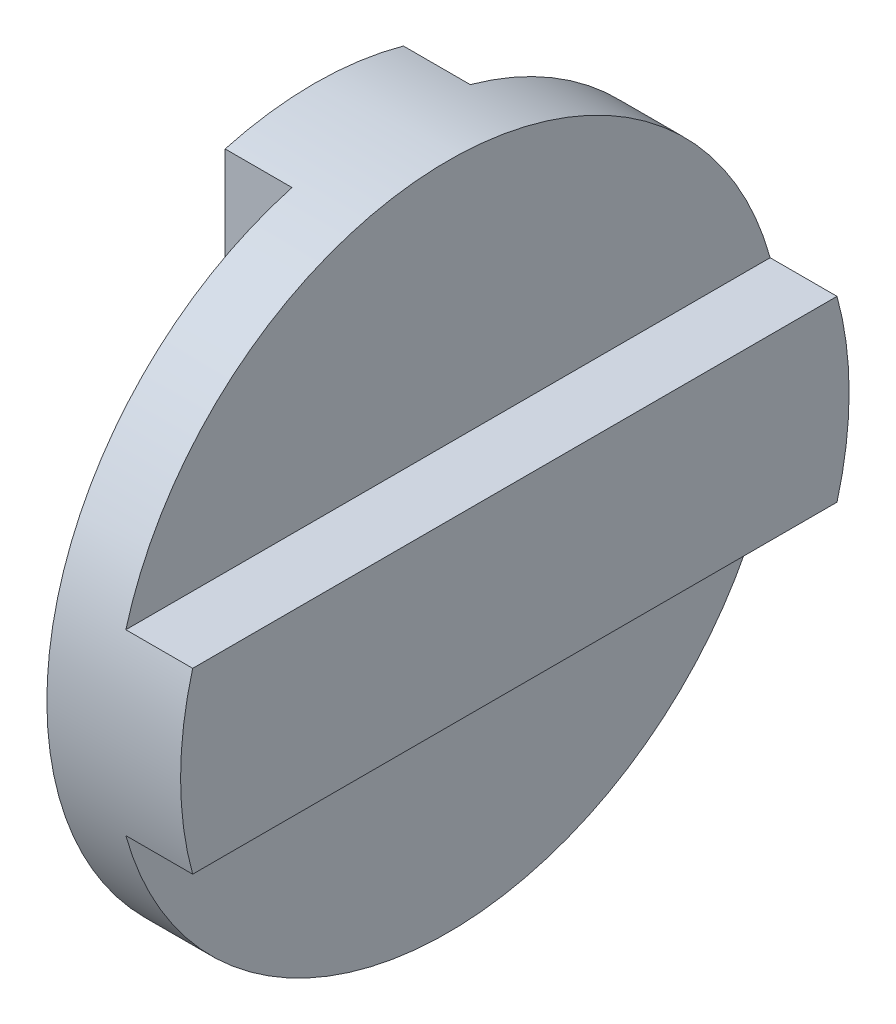
ISO-10303-21;
HEADER;
FILE_DESCRIPTION(('STEP AP214'),'2;1');
FILE_NAME('part.step','',(''),(''),'','','');
FILE_SCHEMA(('AUTOMOTIVE_DESIGN { 1 0 10303 214 1 1 1 1 }'));
ENDSEC;
DATA;
#1=APPLICATION_CONTEXT('core data for automotive mechanical design processes');
#2=APPLICATION_PROTOCOL_DEFINITION('international standard','automotive_design',2000,#1);
#3=PRODUCT_CONTEXT('',#1,'mechanical');
#4=PRODUCT('Part','Part','',(#3));
#5=PRODUCT_RELATED_PRODUCT_CATEGORY('part','',(#4));
#6=PRODUCT_DEFINITION_FORMATION('','',#4);
#7=PRODUCT_DEFINITION_CONTEXT('part definition',#1,'design');
#8=PRODUCT_DEFINITION('design','',#6,#7);
#9=PRODUCT_DEFINITION_SHAPE('','',#8);
#10=(LENGTH_UNIT() NAMED_UNIT(*) SI_UNIT(.MILLI.,.METRE.));
#11=(NAMED_UNIT(*) PLANE_ANGLE_UNIT() SI_UNIT($,.RADIAN.));
#12=(NAMED_UNIT(*) SI_UNIT($,.STERADIAN.) SOLID_ANGLE_UNIT());
#13=UNCERTAINTY_MEASURE_WITH_UNIT(LENGTH_MEASURE(1.E-05),#10,'distance_accuracy_value','');
#14=(GEOMETRIC_REPRESENTATION_CONTEXT(3) GLOBAL_UNCERTAINTY_ASSIGNED_CONTEXT((#13)) GLOBAL_UNIT_ASSIGNED_CONTEXT((#10,
#11,#12)) REPRESENTATION_CONTEXT('',''));
#15=CARTESIAN_POINT('',(0.,0.,0.));
#16=DIRECTION('',(0.,0.,1.));
#17=DIRECTION('',(1.,0.,0.));
#18=AXIS2_PLACEMENT_3D('',#15,#16,#17);
#19=CARTESIAN_POINT('',(0.,0.,0.));
#20=DIRECTION('',(1.,0.,0.));
#21=DIRECTION('',(0.,0.,-1.));
#22=AXIS2_PLACEMENT_3D('',#19,#20,#21);
#23=PLANE('',#22);
#24=DIRECTION('',(0.,1.,0.));
#25=VECTOR('',#24,1.);
#26=CARTESIAN_POINT('',(0.,72.2841614740048,20.));
#27=LINE('',#26,#25);
#28=CARTESIAN_POINT('',(0.,-72.2841614740048,20.));
#29=VERTEX_POINT('',#28);
#30=CARTESIAN_POINT('',(0.,72.2841614740048,20.));
#31=VERTEX_POINT('',#30);
#32=EDGE_CURVE('E61',#29,#31,#27,.T.);
#33=ORIENTED_EDGE('',*,*,#32,.F.);
#34=CARTESIAN_POINT('',(0.,0.,0.));
#35=DIRECTION('',(1.,0.,0.));
#36=DIRECTION('',(0.,0.,-1.));
#37=AXIS2_PLACEMENT_3D('',#34,#35,#36);
#38=CIRCLE('',#37,75.);
#39=EDGE_CURVE('E64',#31,#29,#38,.T.);
#40=ORIENTED_EDGE('',*,*,#39,.F.);
#41=EDGE_LOOP('',(#33,#40));
#42=FACE_BOUND('',#41,.T.);
#43=ADVANCED_FACE('F45',(#42),#23,.F.);
#44=DIRECTION('',(0.,-1.,0.));
#45=VECTOR('',#44,1.);
#46=CARTESIAN_POINT('',(0.,72.2841614740048,-20.));
#47=LINE('',#46,#45);
#48=CARTESIAN_POINT('',(0.,72.2841614740048,-20.));
#49=VERTEX_POINT('',#48);
#50=CARTESIAN_POINT('',(0.,-72.2841614740048,-20.));
#51=VERTEX_POINT('',#50);
#52=EDGE_CURVE('E302',#49,#51,#47,.T.);
#53=ORIENTED_EDGE('',*,*,#52,.F.);
#54=EDGE_CURVE('E49',#51,#49,#38,.T.);
#55=ORIENTED_EDGE('',*,*,#54,.F.);
#56=EDGE_LOOP('',(#53,#55));
#57=FACE_BOUND('',#56,.T.);
#58=ADVANCED_FACE('F201',(#57),#23,.F.);
#59=CARTESIAN_POINT('',(15.,0.,0.));
#60=DIRECTION('',(1.,0.,0.));
#61=DIRECTION('',(0.,0.,-1.));
#62=AXIS2_PLACEMENT_3D('',#59,#60,#61);
#63=PLANE('',#62);
#64=DIRECTION('',(0.,0.,1.));
#65=VECTOR('',#64,1.);
#66=CARTESIAN_POINT('',(15.,20.,72.2841614740048));
#67=LINE('',#66,#65);
#68=CARTESIAN_POINT('',(15.,20.,-72.2841614740048));
#69=VERTEX_POINT('',#68);
#70=CARTESIAN_POINT('',(15.,20.,72.2841614740048));
#71=VERTEX_POINT('',#70);
#72=EDGE_CURVE('E138',#69,#71,#67,.T.);
#73=ORIENTED_EDGE('',*,*,#72,.F.);
#74=CARTESIAN_POINT('',(15.,0.,0.));
#75=DIRECTION('',(1.,0.,0.));
#76=DIRECTION('',(0.,0.,-1.));
#77=AXIS2_PLACEMENT_3D('',#74,#75,#76);
#78=CIRCLE('',#77,75.);
#79=EDGE_CURVE('E11',#69,#71,#78,.T.);
#80=ORIENTED_EDGE('',*,*,#79,.T.);
#81=EDGE_LOOP('',(#73,#80));
#82=FACE_BOUND('',#81,.T.);
#83=ADVANCED_FACE('F199',(#82),#63,.T.);
#84=CARTESIAN_POINT('',(15.,0.,0.));
#85=DIRECTION('',(-1.,0.,0.));
#86=DIRECTION('',(0.,0.,1.));
#87=AXIS2_PLACEMENT_3D('',#84,#85,#86);
#88=CYLINDRICAL_SURFACE('',#87,75.);
#89=ORIENTED_EDGE('',*,*,#79,.F.);
#90=DIRECTION('',(-1.,0.,0.));
#91=VECTOR('',#90,1.);
#92=CARTESIAN_POINT('',(30.,20.,-72.2841614740048));
#93=LINE('',#92,#91);
#94=CARTESIAN_POINT('',(30.,20.,-72.2841614740048));
#95=VERTEX_POINT('',#94);
#96=EDGE_CURVE('E164',#95,#69,#93,.T.);
#97=ORIENTED_EDGE('',*,*,#96,.F.);
#98=CARTESIAN_POINT('',(30.,0.,0.));
#99=DIRECTION('',(1.,0.,0.));
#100=DIRECTION('',(0.,0.,-1.));
#101=AXIS2_PLACEMENT_3D('',#98,#99,#100);
#102=CIRCLE('',#101,75.);
#103=CARTESIAN_POINT('',(30.,-20.,-72.2841614740048));
#104=VERTEX_POINT('',#103);
#105=EDGE_CURVE('E151',#104,#95,#102,.T.);
#106=ORIENTED_EDGE('',*,*,#105,.F.);
#107=DIRECTION('',(-1.,0.,0.));
#108=VECTOR('',#107,1.);
#109=CARTESIAN_POINT('',(30.,-20.,-72.2841614740048));
#110=LINE('',#109,#108);
#111=CARTESIAN_POINT('',(15.,-20.,-72.2841614740048));
#112=VERTEX_POINT('',#111);
#113=EDGE_CURVE('E168',#104,#112,#110,.T.);
#114=ORIENTED_EDGE('',*,*,#113,.T.);
#115=CARTESIAN_POINT('',(15.,-20.,72.2841614740048));
#116=VERTEX_POINT('',#115);
#117=EDGE_CURVE('E55',#116,#112,#78,.T.);
#118=ORIENTED_EDGE('',*,*,#117,.F.);
#119=DIRECTION('',(-1.,0.,0.));
#120=VECTOR('',#119,1.);
#121=CARTESIAN_POINT('',(30.,-20.,72.2841614740048));
#122=LINE('',#121,#120);
#123=CARTESIAN_POINT('',(30.,-20.,72.2841614740048));
#124=VERTEX_POINT('',#123);
#125=EDGE_CURVE('E172',#124,#116,#122,.T.);
#126=ORIENTED_EDGE('',*,*,#125,.F.);
#127=CARTESIAN_POINT('',(30.,0.,0.));
#128=DIRECTION('',(1.,0.,0.));
#129=DIRECTION('',(0.,0.,-1.));
#130=AXIS2_PLACEMENT_3D('',#127,#128,#129);
#131=CIRCLE('',#130,75.);
#132=CARTESIAN_POINT('',(30.,20.,72.2841614740048));
#133=VERTEX_POINT('',#132);
#134=EDGE_CURVE('E144',#133,#124,#131,.T.);
#135=ORIENTED_EDGE('',*,*,#134,.F.);
#136=DIRECTION('',(-1.,0.,0.));
#137=VECTOR('',#136,1.);
#138=CARTESIAN_POINT('',(30.,20.,72.2841614740048));
#139=LINE('',#138,#137);
#140=EDGE_CURVE('E156',#133,#71,#139,.T.);
#141=ORIENTED_EDGE('',*,*,#140,.T.);
#142=EDGE_LOOP('',(#89,#97,#106,#114,#118,#126,#135,#141));
#143=FACE_BOUND('',#142,.T.);
#144=ORIENTED_EDGE('',*,*,#54,.T.);
#145=DIRECTION('',(1.,0.,0.));
#146=VECTOR('',#145,1.);
#147=CARTESIAN_POINT('',(-15.,72.2841614740048,-20.));
#148=LINE('',#147,#146);
#149=CARTESIAN_POINT('',(-15.,72.2841614740048,-20.));
#150=VERTEX_POINT('',#149);
#151=EDGE_CURVE('E113',#150,#49,#148,.T.);
#152=ORIENTED_EDGE('',*,*,#151,.F.);
#153=CARTESIAN_POINT('',(-15.,0.,0.));
#154=DIRECTION('',(-1.,0.,0.));
#155=DIRECTION('',(0.,0.,1.));
#156=AXIS2_PLACEMENT_3D('',#153,#154,#155);
#157=CIRCLE('',#156,75.);
#158=CARTESIAN_POINT('',(-15.,72.2841614740048,20.));
#159=VERTEX_POINT('',#158);
#160=EDGE_CURVE('E120',#159,#150,#157,.T.);
#161=ORIENTED_EDGE('',*,*,#160,.F.);
#162=DIRECTION('',(1.,0.,0.));
#163=VECTOR('',#162,1.);
#164=CARTESIAN_POINT('',(-15.,72.2841614740048,20.));
#165=LINE('',#164,#163);
#166=EDGE_CURVE('E300',#159,#31,#165,.T.);
#167=ORIENTED_EDGE('',*,*,#166,.T.);
#168=ORIENTED_EDGE('',*,*,#39,.T.);
#169=DIRECTION('',(1.,0.,0.));
#170=VECTOR('',#169,1.);
#171=CARTESIAN_POINT('',(-15.,-72.2841614740048,20.));
#172=LINE('',#171,#170);
#173=CARTESIAN_POINT('',(-15.,-72.2841614740048,20.));
#174=VERTEX_POINT('',#173);
#175=EDGE_CURVE('E140',#174,#29,#172,.T.);
#176=ORIENTED_EDGE('',*,*,#175,.F.);
#177=CARTESIAN_POINT('',(-15.,0.,0.));
#178=DIRECTION('',(-1.,0.,0.));
#179=DIRECTION('',(0.,0.,1.));
#180=AXIS2_PLACEMENT_3D('',#177,#178,#179);
#181=CIRCLE('',#180,75.);
#182=CARTESIAN_POINT('',(-15.,-72.2841614740048,-20.));
#183=VERTEX_POINT('',#182);
#184=EDGE_CURVE('E119',#183,#174,#181,.T.);
#185=ORIENTED_EDGE('',*,*,#184,.F.);
#186=DIRECTION('',(1.,0.,0.));
#187=VECTOR('',#186,1.);
#188=CARTESIAN_POINT('',(-15.,-72.2841614740048,-20.));
#189=LINE('',#188,#187);
#190=EDGE_CURVE('E115',#183,#51,#189,.T.);
#191=ORIENTED_EDGE('',*,*,#190,.T.);
#192=EDGE_LOOP('',(#144,#152,#161,#167,#168,#176,#185,#191));
#193=FACE_BOUND('',#192,.T.);
#194=ADVANCED_FACE('F47',(#143,#193),#88,.T.);
#195=DIRECTION('',(0.,0.,-1.));
#196=VECTOR('',#195,1.);
#197=CARTESIAN_POINT('',(15.,-20.,72.2841614740048));
#198=LINE('',#197,#196);
#199=EDGE_CURVE('E133',#116,#112,#198,.T.);
#200=ORIENTED_EDGE('',*,*,#199,.F.);
#201=ORIENTED_EDGE('',*,*,#117,.T.);
#202=EDGE_LOOP('',(#200,#201));
#203=FACE_BOUND('',#202,.T.);
#204=ADVANCED_FACE('F184',(#203),#63,.T.);
#205=CARTESIAN_POINT('',(30.,-20.,72.2841614740048));
#206=DIRECTION('',(0.,1.,0.));
#207=DIRECTION('',(0.,0.,1.));
#208=AXIS2_PLACEMENT_3D('',#205,#206,#207);
#209=PLANE('',#208);
#210=ORIENTED_EDGE('',*,*,#199,.T.);
#211=ORIENTED_EDGE('',*,*,#113,.F.);
#212=DIRECTION('',(0.,0.,-1.));
#213=VECTOR('',#212,1.);
#214=CARTESIAN_POINT('',(30.,-20.,72.2841614740048));
#215=LINE('',#214,#213);
#216=EDGE_CURVE('E148',#124,#104,#215,.T.);
#217=ORIENTED_EDGE('',*,*,#216,.F.);
#218=ORIENTED_EDGE('',*,*,#125,.T.);
#219=EDGE_LOOP('',(#210,#211,#217,#218));
#220=FACE_BOUND('',#219,.T.);
#221=ADVANCED_FACE('F187',(#220),#209,.F.);
#222=CARTESIAN_POINT('',(30.,20.,72.2841614740048));
#223=DIRECTION('',(0.,-1.,0.));
#224=DIRECTION('',(0.,0.,-1.));
#225=AXIS2_PLACEMENT_3D('',#222,#223,#224);
#226=PLANE('',#225);
#227=ORIENTED_EDGE('',*,*,#72,.T.);
#228=ORIENTED_EDGE('',*,*,#140,.F.);
#229=DIRECTION('',(0.,0.,1.));
#230=VECTOR('',#229,1.);
#231=CARTESIAN_POINT('',(30.,20.,72.2841614740048));
#232=LINE('',#231,#230);
#233=EDGE_CURVE('E154',#95,#133,#232,.T.);
#234=ORIENTED_EDGE('',*,*,#233,.F.);
#235=ORIENTED_EDGE('',*,*,#96,.T.);
#236=EDGE_LOOP('',(#227,#228,#234,#235));
#237=FACE_BOUND('',#236,.T.);
#238=ADVANCED_FACE('F197',(#237),#226,.F.);
#239=CARTESIAN_POINT('',(30.,0.,0.));
#240=DIRECTION('',(1.,0.,0.));
#241=DIRECTION('',(0.,0.,-1.));
#242=AXIS2_PLACEMENT_3D('',#239,#240,#241);
#243=PLANE('',#242);
#244=ORIENTED_EDGE('',*,*,#134,.T.);
#245=ORIENTED_EDGE('',*,*,#216,.T.);
#246=ORIENTED_EDGE('',*,*,#105,.T.);
#247=ORIENTED_EDGE('',*,*,#233,.T.);
#248=EDGE_LOOP('',(#244,#245,#246,#247));
#249=FACE_BOUND('',#248,.T.);
#250=ADVANCED_FACE('F193',(#249),#243,.T.);
#251=CARTESIAN_POINT('',(-15.,72.2841614740048,-20.));
#252=DIRECTION('',(0.,0.,1.));
#253=DIRECTION('',(1.,0.,0.));
#254=AXIS2_PLACEMENT_3D('',#251,#252,#253);
#255=PLANE('',#254);
#256=ORIENTED_EDGE('',*,*,#52,.T.);
#257=ORIENTED_EDGE('',*,*,#190,.F.);
#258=DIRECTION('',(0.,-1.,0.));
#259=VECTOR('',#258,1.);
#260=CARTESIAN_POINT('',(-15.,72.2841614740048,-20.));
#261=LINE('',#260,#259);
#262=EDGE_CURVE('E108',#150,#183,#261,.T.);
#263=ORIENTED_EDGE('',*,*,#262,.F.);
#264=ORIENTED_EDGE('',*,*,#151,.T.);
#265=EDGE_LOOP('',(#256,#257,#263,#264));
#266=FACE_BOUND('',#265,.T.);
#267=ADVANCED_FACE('F111',(#266),#255,.F.);
#268=CARTESIAN_POINT('',(-15.,72.2841614740048,20.));
#269=DIRECTION('',(0.,0.,-1.));
#270=DIRECTION('',(-1.,0.,0.));
#271=AXIS2_PLACEMENT_3D('',#268,#269,#270);
#272=PLANE('',#271);
#273=ORIENTED_EDGE('',*,*,#32,.T.);
#274=ORIENTED_EDGE('',*,*,#166,.F.);
#275=DIRECTION('',(0.,1.,0.));
#276=VECTOR('',#275,1.);
#277=CARTESIAN_POINT('',(-15.,72.2841614740048,20.));
#278=LINE('',#277,#276);
#279=EDGE_CURVE('E125',#174,#159,#278,.T.);
#280=ORIENTED_EDGE('',*,*,#279,.F.);
#281=ORIENTED_EDGE('',*,*,#175,.T.);
#282=EDGE_LOOP('',(#273,#274,#280,#281));
#283=FACE_BOUND('',#282,.T.);
#284=ADVANCED_FACE('F234',(#283),#272,.F.);
#285=CARTESIAN_POINT('',(-15.,0.,0.));
#286=DIRECTION('',(-1.,0.,0.));
#287=DIRECTION('',(0.,0.,1.));
#288=AXIS2_PLACEMENT_3D('',#285,#286,#287);
#289=PLANE('',#288);
#290=ORIENTED_EDGE('',*,*,#160,.T.);
#291=ORIENTED_EDGE('',*,*,#262,.T.);
#292=ORIENTED_EDGE('',*,*,#184,.T.);
#293=ORIENTED_EDGE('',*,*,#279,.T.);
#294=EDGE_LOOP('',(#290,#291,#292,#293));
#295=FACE_BOUND('',#294,.T.);
#296=ADVANCED_FACE('F123',(#295),#289,.T.);
#297=CLOSED_SHELL('',(#43,#58,#83,#194,#204,#221,#238,#250,#267,#284,#296));
#298=MANIFOLD_SOLID_BREP('B2',#297);
#299=ADVANCED_BREP_SHAPE_REPRESENTATION('',(#18,#298),#14);
#300=SHAPE_DEFINITION_REPRESENTATION(#9,#299);
ENDSEC;
END-ISO-10303-21;
